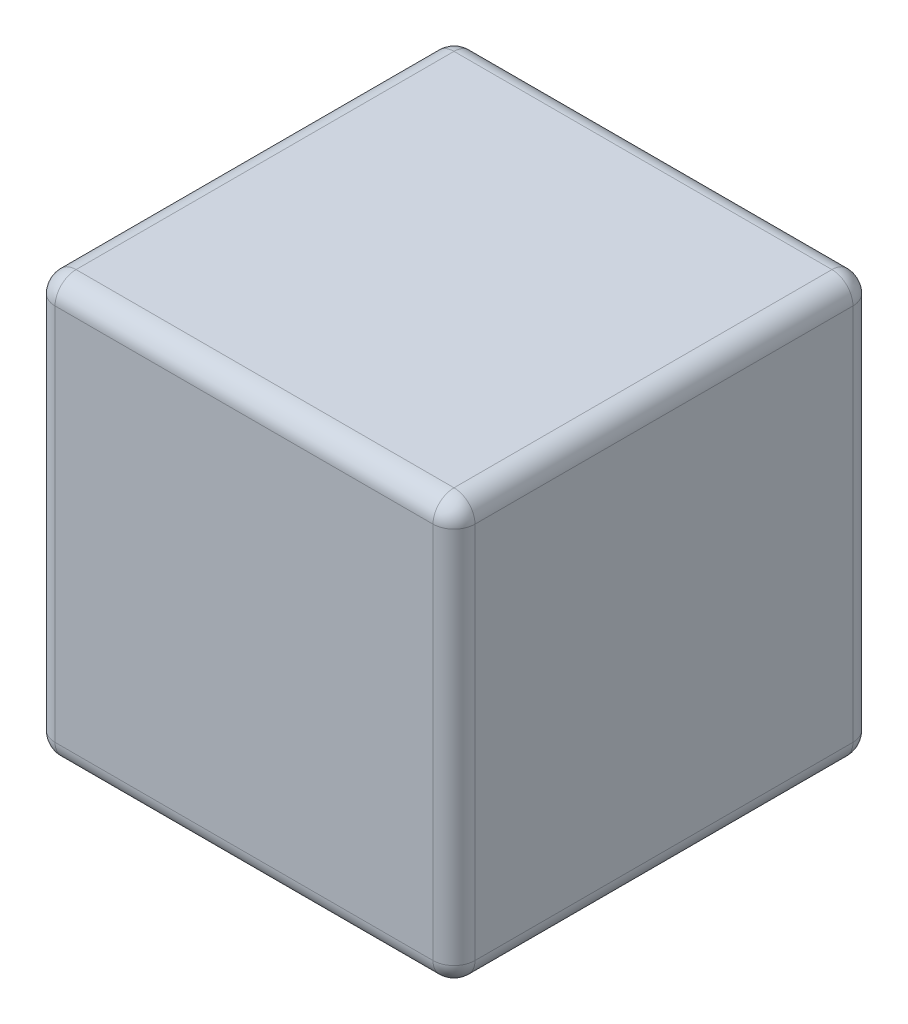
ISO-10303-21;
HEADER;
FILE_DESCRIPTION(('STEP AP214'),'2;1');
FILE_NAME('part.step','',(''),(''),'','','');
FILE_SCHEMA(('AUTOMOTIVE_DESIGN { 1 0 10303 214 1 1 1 1 }'));
ENDSEC;
DATA;
#1=APPLICATION_CONTEXT('core data for automotive mechanical design processes');
#2=APPLICATION_PROTOCOL_DEFINITION('international standard','automotive_design',2000,#1);
#3=PRODUCT_CONTEXT('',#1,'mechanical');
#4=PRODUCT('Part','Part','',(#3));
#5=PRODUCT_RELATED_PRODUCT_CATEGORY('part','',(#4));
#6=PRODUCT_DEFINITION_FORMATION('','',#4);
#7=PRODUCT_DEFINITION_CONTEXT('part definition',#1,'design');
#8=PRODUCT_DEFINITION('design','',#6,#7);
#9=PRODUCT_DEFINITION_SHAPE('','',#8);
#10=(LENGTH_UNIT() NAMED_UNIT(*) SI_UNIT(.MILLI.,.METRE.));
#11=(NAMED_UNIT(*) PLANE_ANGLE_UNIT() SI_UNIT($,.RADIAN.));
#12=(NAMED_UNIT(*) SI_UNIT($,.STERADIAN.) SOLID_ANGLE_UNIT());
#13=UNCERTAINTY_MEASURE_WITH_UNIT(LENGTH_MEASURE(1.E-05),#10,'distance_accuracy_value','');
#14=(GEOMETRIC_REPRESENTATION_CONTEXT(3) GLOBAL_UNCERTAINTY_ASSIGNED_CONTEXT((#13)) GLOBAL_UNIT_ASSIGNED_CONTEXT((#10,
#11,#12)) REPRESENTATION_CONTEXT('',''));
#15=CARTESIAN_POINT('',(0.,0.,0.));
#16=DIRECTION('',(0.,0.,1.));
#17=DIRECTION('',(1.,0.,0.));
#18=AXIS2_PLACEMENT_3D('',#15,#16,#17);
#19=CARTESIAN_POINT('',(0.,100.,0.));
#20=DIRECTION('',(1.,0.,0.));
#21=DIRECTION('',(0.,0.,-1.));
#22=AXIS2_PLACEMENT_3D('',#19,#20,#21);
#23=PLANE('',#22);
#24=DIRECTION('',(0.,0.,1.));
#25=VECTOR('',#24,1.);
#26=CARTESIAN_POINT('',(0.,95.,0.));
#27=LINE('',#26,#25);
#28=CARTESIAN_POINT('',(0.,95.,-5.));
#29=VERTEX_POINT('',#28);
#30=CARTESIAN_POINT('',(0.,95.,-95.));
#31=VERTEX_POINT('',#30);
#32=EDGE_CURVE('E192',#29,#31,#27,.F.);
#33=ORIENTED_EDGE('',*,*,#32,.T.);
#34=DIRECTION('',(0.,-1.,0.));
#35=VECTOR('',#34,1.);
#36=CARTESIAN_POINT('',(0.,100.,-95.));
#37=LINE('',#36,#35);
#38=CARTESIAN_POINT('',(0.,5.,-95.));
#39=VERTEX_POINT('',#38);
#40=EDGE_CURVE('E194',#31,#39,#37,.T.);
#41=ORIENTED_EDGE('',*,*,#40,.T.);
#42=DIRECTION('',(0.,0.,1.));
#43=VECTOR('',#42,1.);
#44=CARTESIAN_POINT('',(0.,5.,0.));
#45=LINE('',#44,#43);
#46=CARTESIAN_POINT('',(0.,5.,-5.));
#47=VERTEX_POINT('',#46);
#48=EDGE_CURVE('E190',#39,#47,#45,.T.);
#49=ORIENTED_EDGE('',*,*,#48,.T.);
#50=DIRECTION('',(0.,-1.,0.));
#51=VECTOR('',#50,1.);
#52=CARTESIAN_POINT('',(0.,100.,-5.));
#53=LINE('',#52,#51);
#54=EDGE_CURVE('E188',#47,#29,#53,.F.);
#55=ORIENTED_EDGE('',*,*,#54,.T.);
#56=EDGE_LOOP('',(#33,#41,#49,#55));
#57=FACE_BOUND('',#56,.T.);
#58=ADVANCED_FACE('F34',(#57),#23,.F.);
#59=CARTESIAN_POINT('',(0.,100.,0.));
#60=DIRECTION('',(0.,0.,-1.));
#61=DIRECTION('',(-1.,0.,0.));
#62=AXIS2_PLACEMENT_3D('',#59,#60,#61);
#63=PLANE('',#62);
#64=DIRECTION('',(1.,0.,0.));
#65=VECTOR('',#64,1.);
#66=CARTESIAN_POINT('',(0.,95.,0.));
#67=LINE('',#66,#65);
#68=CARTESIAN_POINT('',(95.,95.,0.));
#69=VERTEX_POINT('',#68);
#70=CARTESIAN_POINT('',(5.,95.,0.));
#71=VERTEX_POINT('',#70);
#72=EDGE_CURVE('E43',#69,#71,#67,.F.);
#73=ORIENTED_EDGE('',*,*,#72,.T.);
#74=DIRECTION('',(0.,-1.,0.));
#75=VECTOR('',#74,1.);
#76=CARTESIAN_POINT('',(5.,100.,0.));
#77=LINE('',#76,#75);
#78=CARTESIAN_POINT('',(5.,5.,0.));
#79=VERTEX_POINT('',#78);
#80=EDGE_CURVE('E11',#71,#79,#77,.T.);
#81=ORIENTED_EDGE('',*,*,#80,.T.);
#82=DIRECTION('',(1.,0.,0.));
#83=VECTOR('',#82,1.);
#84=CARTESIAN_POINT('',(100.,5.,0.));
#85=LINE('',#84,#83);
#86=CARTESIAN_POINT('',(95.,5.,0.));
#87=VERTEX_POINT('',#86);
#88=EDGE_CURVE('E197',#79,#87,#85,.T.);
#89=ORIENTED_EDGE('',*,*,#88,.T.);
#90=DIRECTION('',(0.,-1.,0.));
#91=VECTOR('',#90,1.);
#92=CARTESIAN_POINT('',(95.,100.,0.));
#93=LINE('',#92,#91);
#94=EDGE_CURVE('E54',#87,#69,#93,.F.);
#95=ORIENTED_EDGE('',*,*,#94,.T.);
#96=EDGE_LOOP('',(#73,#81,#89,#95));
#97=FACE_BOUND('',#96,.T.);
#98=ADVANCED_FACE('F349',(#97),#63,.F.);
#99=CARTESIAN_POINT('',(100.,100.,0.));
#100=DIRECTION('',(-1.,0.,0.));
#101=DIRECTION('',(0.,0.,1.));
#102=AXIS2_PLACEMENT_3D('',#99,#100,#101);
#103=PLANE('',#102);
#104=DIRECTION('',(0.,0.,-1.));
#105=VECTOR('',#104,1.);
#106=CARTESIAN_POINT('',(100.,5.,-100.));
#107=LINE('',#106,#105);
#108=CARTESIAN_POINT('',(100.,5.,-5.));
#109=VERTEX_POINT('',#108);
#110=CARTESIAN_POINT('',(100.,5.,-95.));
#111=VERTEX_POINT('',#110);
#112=EDGE_CURVE('E167',#109,#111,#107,.T.);
#113=ORIENTED_EDGE('',*,*,#112,.T.);
#114=DIRECTION('',(0.,-1.,0.));
#115=VECTOR('',#114,1.);
#116=CARTESIAN_POINT('',(100.,100.,-95.));
#117=LINE('',#116,#115);
#118=CARTESIAN_POINT('',(100.,95.,-95.));
#119=VERTEX_POINT('',#118);
#120=EDGE_CURVE('E129',#111,#119,#117,.F.);
#121=ORIENTED_EDGE('',*,*,#120,.T.);
#122=DIRECTION('',(0.,0.,-1.));
#123=VECTOR('',#122,1.);
#124=CARTESIAN_POINT('',(100.,95.,0.));
#125=LINE('',#124,#123);
#126=CARTESIAN_POINT('',(100.,95.,-5.));
#127=VERTEX_POINT('',#126);
#128=EDGE_CURVE('E161',#119,#127,#125,.F.);
#129=ORIENTED_EDGE('',*,*,#128,.T.);
#130=DIRECTION('',(0.,-1.,0.));
#131=VECTOR('',#130,1.);
#132=CARTESIAN_POINT('',(100.,100.,-5.));
#133=LINE('',#132,#131);
#134=EDGE_CURVE('E159',#127,#109,#133,.T.);
#135=ORIENTED_EDGE('',*,*,#134,.T.);
#136=EDGE_LOOP('',(#113,#121,#129,#135));
#137=FACE_BOUND('',#136,.T.);
#138=ADVANCED_FACE('F319',(#137),#103,.F.);
#139=CARTESIAN_POINT('',(0.,100.,-100.));
#140=DIRECTION('',(0.,0.,1.));
#141=DIRECTION('',(1.,0.,0.));
#142=AXIS2_PLACEMENT_3D('',#139,#140,#141);
#143=PLANE('',#142);
#144=DIRECTION('',(-1.,0.,0.));
#145=VECTOR('',#144,1.);
#146=CARTESIAN_POINT('',(0.,95.,-100.));
#147=LINE('',#146,#145);
#148=CARTESIAN_POINT('',(4.99999999999997,95.,-100.));
#149=VERTEX_POINT('',#148);
#150=CARTESIAN_POINT('',(95.,95.,-100.));
#151=VERTEX_POINT('',#150);
#152=EDGE_CURVE('E157',#149,#151,#147,.F.);
#153=ORIENTED_EDGE('',*,*,#152,.T.);
#154=DIRECTION('',(0.,-1.,0.));
#155=VECTOR('',#154,1.);
#156=CARTESIAN_POINT('',(95.,100.,-100.));
#157=LINE('',#156,#155);
#158=CARTESIAN_POINT('',(95.,5.,-100.));
#159=VERTEX_POINT('',#158);
#160=EDGE_CURVE('E127',#151,#159,#157,.T.);
#161=ORIENTED_EDGE('',*,*,#160,.T.);
#162=DIRECTION('',(-1.,0.,0.));
#163=VECTOR('',#162,1.);
#164=CARTESIAN_POINT('',(0.,5.,-100.));
#165=LINE('',#164,#163);
#166=CARTESIAN_POINT('',(4.99999999999997,5.,-100.));
#167=VERTEX_POINT('',#166);
#168=EDGE_CURVE('E145',#159,#167,#165,.T.);
#169=ORIENTED_EDGE('',*,*,#168,.T.);
#170=DIRECTION('',(0.,-1.,0.));
#171=VECTOR('',#170,1.);
#172=CARTESIAN_POINT('',(4.99999999999997,100.,-100.));
#173=LINE('',#172,#171);
#174=EDGE_CURVE('E151',#167,#149,#173,.F.);
#175=ORIENTED_EDGE('',*,*,#174,.T.);
#176=EDGE_LOOP('',(#153,#161,#169,#175));
#177=FACE_BOUND('',#176,.T.);
#178=CARTESIAN_POINT('',(50.,50.,-100.));
#179=DIRECTION('',(0.,0.,-1.));
#180=DIRECTION('',(-1.,0.,0.));
#181=AXIS2_PLACEMENT_3D('',#178,#179,#180);
#182=CIRCLE('',#181,10.);
#183=CARTESIAN_POINT('',(40.,50.,-100.));
#184=VERTEX_POINT('',#183);
#185=EDGE_CURVE('E289',#184,#184,#182,.T.);
#186=ORIENTED_EDGE('',*,*,#185,.F.);
#187=EDGE_LOOP('',(#186));
#188=FACE_BOUND('',#187,.T.);
#189=ADVANCED_FACE('F154',(#177,#188),#143,.F.);
#190=CARTESIAN_POINT('',(0.,100.,0.));
#191=DIRECTION('',(0.,-1.,0.));
#192=DIRECTION('',(0.,0.,-1.));
#193=AXIS2_PLACEMENT_3D('',#190,#191,#192);
#194=PLANE('',#193);
#195=DIRECTION('',(0.,0.,-1.));
#196=VECTOR('',#195,1.);
#197=CARTESIAN_POINT('',(95.,100.,0.));
#198=LINE('',#197,#196);
#199=CARTESIAN_POINT('',(95.,100.,-5.));
#200=VERTEX_POINT('',#199);
#201=CARTESIAN_POINT('',(95.,100.,-95.));
#202=VERTEX_POINT('',#201);
#203=EDGE_CURVE('E183',#200,#202,#198,.T.);
#204=ORIENTED_EDGE('',*,*,#203,.T.);
#205=DIRECTION('',(-1.,0.,0.));
#206=VECTOR('',#205,1.);
#207=CARTESIAN_POINT('',(0.,100.,-95.));
#208=LINE('',#207,#206);
#209=CARTESIAN_POINT('',(4.99999999999997,100.,-95.));
#210=VERTEX_POINT('',#209);
#211=EDGE_CURVE('E185',#202,#210,#208,.T.);
#212=ORIENTED_EDGE('',*,*,#211,.T.);
#213=DIRECTION('',(0.,0.,1.));
#214=VECTOR('',#213,1.);
#215=CARTESIAN_POINT('',(5.,100.,0.));
#216=LINE('',#215,#214);
#217=CARTESIAN_POINT('',(5.,100.,-5.));
#218=VERTEX_POINT('',#217);
#219=EDGE_CURVE('E181',#210,#218,#216,.T.);
#220=ORIENTED_EDGE('',*,*,#219,.T.);
#221=DIRECTION('',(1.,0.,0.));
#222=VECTOR('',#221,1.);
#223=CARTESIAN_POINT('',(0.,100.,-5.));
#224=LINE('',#223,#222);
#225=EDGE_CURVE('E179',#218,#200,#224,.T.);
#226=ORIENTED_EDGE('',*,*,#225,.T.);
#227=EDGE_LOOP('',(#204,#212,#220,#226));
#228=FACE_BOUND('',#227,.T.);
#229=ADVANCED_FACE('F622',(#228),#194,.F.);
#230=CARTESIAN_POINT('',(0.,0.,0.));
#231=DIRECTION('',(0.,-1.,0.));
#232=DIRECTION('',(0.,0.,-1.));
#233=AXIS2_PLACEMENT_3D('',#230,#231,#232);
#234=PLANE('',#233);
#235=DIRECTION('',(0.,0.,-1.));
#236=VECTOR('',#235,1.);
#237=CARTESIAN_POINT('',(95.,0.,0.));
#238=LINE('',#237,#236);
#239=CARTESIAN_POINT('',(95.,0.,-95.));
#240=VERTEX_POINT('',#239);
#241=CARTESIAN_POINT('',(95.,0.,-5.));
#242=VERTEX_POINT('',#241);
#243=EDGE_CURVE('E174',#240,#242,#238,.F.);
#244=ORIENTED_EDGE('',*,*,#243,.T.);
#245=DIRECTION('',(1.,0.,0.));
#246=VECTOR('',#245,1.);
#247=CARTESIAN_POINT('',(0.,0.,-5.));
#248=LINE('',#247,#246);
#249=CARTESIAN_POINT('',(5.,0.,-5.));
#250=VERTEX_POINT('',#249);
#251=EDGE_CURVE('E177',#242,#250,#248,.F.);
#252=ORIENTED_EDGE('',*,*,#251,.T.);
#253=DIRECTION('',(0.,0.,1.));
#254=VECTOR('',#253,1.);
#255=CARTESIAN_POINT('',(4.99999999999997,0.,-100.));
#256=LINE('',#255,#254);
#257=CARTESIAN_POINT('',(4.99999999999997,0.,-95.));
#258=VERTEX_POINT('',#257);
#259=EDGE_CURVE('E172',#250,#258,#256,.F.);
#260=ORIENTED_EDGE('',*,*,#259,.T.);
#261=DIRECTION('',(-1.,0.,0.));
#262=VECTOR('',#261,1.);
#263=CARTESIAN_POINT('',(100.,0.,-95.));
#264=LINE('',#263,#262);
#265=EDGE_CURVE('E170',#258,#240,#264,.F.);
#266=ORIENTED_EDGE('',*,*,#265,.T.);
#267=EDGE_LOOP('',(#244,#252,#260,#266));
#268=FACE_BOUND('',#267,.T.);
#269=CARTESIAN_POINT('',(21.7157287525381,0.,-21.7157287525381));
#270=DIRECTION('',(0.,-1.,0.));
#271=DIRECTION('',(0.,0.,-1.));
#272=AXIS2_PLACEMENT_3D('',#269,#270,#271);
#273=CIRCLE('',#272,9.99999999999999);
#274=CARTESIAN_POINT('',(21.7157287525381,0.,-31.7157287525381));
#275=VERTEX_POINT('',#274);
#276=EDGE_CURVE('E276',#275,#275,#273,.T.);
#277=ORIENTED_EDGE('',*,*,#276,.F.);
#278=EDGE_LOOP('',(#277));
#279=FACE_BOUND('',#278,.T.);
#280=CARTESIAN_POINT('',(78.2842712474619,0.,-78.2842712474619));
#281=DIRECTION('',(0.,-1.,0.));
#282=DIRECTION('',(0.,0.,-1.));
#283=AXIS2_PLACEMENT_3D('',#280,#281,#282);
#284=CIRCLE('',#283,9.99999999999999);
#285=CARTESIAN_POINT('',(78.2842712474619,0.,-88.2842712474619));
#286=VERTEX_POINT('',#285);
#287=EDGE_CURVE('E282',#286,#286,#284,.T.);
#288=ORIENTED_EDGE('',*,*,#287,.F.);
#289=EDGE_LOOP('',(#288));
#290=FACE_BOUND('',#289,.T.);
#291=CARTESIAN_POINT('',(78.2842712474619,0.,-21.7157287525381));
#292=DIRECTION('',(0.,-1.,0.));
#293=DIRECTION('',(0.,0.,-1.));
#294=AXIS2_PLACEMENT_3D('',#291,#292,#293);
#295=CIRCLE('',#294,9.99999999999999);
#296=CARTESIAN_POINT('',(78.2842712474619,0.,-31.7157287525381));
#297=VERTEX_POINT('',#296);
#298=EDGE_CURVE('E268',#297,#297,#295,.T.);
#299=ORIENTED_EDGE('',*,*,#298,.F.);
#300=EDGE_LOOP('',(#299));
#301=FACE_BOUND('',#300,.T.);
#302=CARTESIAN_POINT('',(50.,0.,-50.));
#303=DIRECTION('',(0.,-1.,0.));
#304=DIRECTION('',(0.,0.,-1.));
#305=AXIS2_PLACEMENT_3D('',#302,#303,#304);
#306=CIRCLE('',#305,10.);
#307=CARTESIAN_POINT('',(50.,0.,-60.));
#308=VERTEX_POINT('',#307);
#309=EDGE_CURVE('E257',#308,#308,#306,.T.);
#310=ORIENTED_EDGE('',*,*,#309,.F.);
#311=EDGE_LOOP('',(#310));
#312=FACE_BOUND('',#311,.T.);
#313=CARTESIAN_POINT('',(21.7157287525381,0.,-78.2842712474619));
#314=DIRECTION('',(0.,-1.,0.));
#315=DIRECTION('',(0.,0.,-1.));
#316=AXIS2_PLACEMENT_3D('',#313,#314,#315);
#317=CIRCLE('',#316,10.);
#318=CARTESIAN_POINT('',(21.7157287525381,0.,-88.2842712474619));
#319=VERTEX_POINT('',#318);
#320=EDGE_CURVE('E275',#319,#319,#317,.T.);
#321=ORIENTED_EDGE('',*,*,#320,.F.);
#322=EDGE_LOOP('',(#321));
#323=FACE_BOUND('',#322,.T.);
#324=ADVANCED_FACE('F327',(#268,#279,#290,#301,#312,#323),#234,.T.);
#325=CARTESIAN_POINT('',(50.,50.,-90.));
#326=DIRECTION('',(0.,0.,-1.));
#327=DIRECTION('',(-1.,0.,0.));
#328=AXIS2_PLACEMENT_3D('',#325,#326,#327);
#329=CYLINDRICAL_SURFACE('',#328,10.);
#330=CARTESIAN_POINT('',(50.,50.,-90.));
#331=DIRECTION('',(0.,0.,-1.));
#332=DIRECTION('',(-1.,0.,0.));
#333=AXIS2_PLACEMENT_3D('',#330,#331,#332);
#334=CIRCLE('',#333,10.);
#335=CARTESIAN_POINT('',(40.,50.,-90.));
#336=VERTEX_POINT('',#335);
#337=EDGE_CURVE('E152',#336,#336,#334,.T.);
#338=ORIENTED_EDGE('',*,*,#337,.F.);
#339=EDGE_LOOP('',(#338));
#340=FACE_BOUND('',#339,.T.);
#341=ORIENTED_EDGE('',*,*,#185,.T.);
#342=EDGE_LOOP('',(#341));
#343=FACE_BOUND('',#342,.T.);
#344=ADVANCED_FACE('F606',(#340,#343),#329,.F.);
#345=CARTESIAN_POINT('',(50.,50.,-90.));
#346=DIRECTION('',(0.,0.,-1.));
#347=DIRECTION('',(-1.,0.,0.));
#348=AXIS2_PLACEMENT_3D('',#345,#346,#347);
#349=PLANE('',#348);
#350=ORIENTED_EDGE('',*,*,#337,.T.);
#351=EDGE_LOOP('',(#350));
#352=FACE_BOUND('',#351,.T.);
#353=ADVANCED_FACE('F597',(#352),#349,.T.);
#354=CARTESIAN_POINT('',(21.7157287525381,10.,-78.2842712474619));
#355=DIRECTION('',(0.,-1.,0.));
#356=DIRECTION('',(0.,0.,-1.));
#357=AXIS2_PLACEMENT_3D('',#354,#355,#356);
#358=CYLINDRICAL_SURFACE('',#357,10.);
#359=CARTESIAN_POINT('',(21.7157287525381,10.,-78.2842712474619));
#360=DIRECTION('',(0.,-1.,0.));
#361=DIRECTION('',(0.,0.,-1.));
#362=AXIS2_PLACEMENT_3D('',#359,#360,#361);
#363=CIRCLE('',#362,10.);
#364=CARTESIAN_POINT('',(21.7157287525381,10.,-88.2842712474619));
#365=VERTEX_POINT('',#364);
#366=EDGE_CURVE('E286',#365,#365,#363,.T.);
#367=ORIENTED_EDGE('',*,*,#366,.F.);
#368=EDGE_LOOP('',(#367));
#369=FACE_BOUND('',#368,.T.);
#370=ORIENTED_EDGE('',*,*,#320,.T.);
#371=EDGE_LOOP('',(#370));
#372=FACE_BOUND('',#371,.T.);
#373=ADVANCED_FACE('F588',(#369,#372),#358,.F.);
#374=CARTESIAN_POINT('',(21.7157287525381,10.,-78.2842712474619));
#375=DIRECTION('',(0.,-1.,0.));
#376=DIRECTION('',(0.,0.,-1.));
#377=AXIS2_PLACEMENT_3D('',#374,#375,#376);
#378=PLANE('',#377);
#379=ORIENTED_EDGE('',*,*,#366,.T.);
#380=EDGE_LOOP('',(#379));
#381=FACE_BOUND('',#380,.T.);
#382=ADVANCED_FACE('F579',(#381),#378,.T.);
#383=CARTESIAN_POINT('',(50.,10.,-50.));
#384=DIRECTION('',(0.,-1.,0.));
#385=DIRECTION('',(0.,0.,-1.));
#386=AXIS2_PLACEMENT_3D('',#383,#384,#385);
#387=CYLINDRICAL_SURFACE('',#386,10.);
#388=CARTESIAN_POINT('',(50.,10.,-50.));
#389=DIRECTION('',(0.,-1.,0.));
#390=DIRECTION('',(0.,0.,-1.));
#391=AXIS2_PLACEMENT_3D('',#388,#389,#390);
#392=CIRCLE('',#391,10.);
#393=CARTESIAN_POINT('',(50.,10.,-60.));
#394=VERTEX_POINT('',#393);
#395=EDGE_CURVE('E263',#394,#394,#392,.T.);
#396=ORIENTED_EDGE('',*,*,#395,.F.);
#397=EDGE_LOOP('',(#396));
#398=FACE_BOUND('',#397,.T.);
#399=ORIENTED_EDGE('',*,*,#309,.T.);
#400=EDGE_LOOP('',(#399));
#401=FACE_BOUND('',#400,.T.);
#402=ADVANCED_FACE('F570',(#398,#401),#387,.F.);
#403=CARTESIAN_POINT('',(50.,10.,-50.));
#404=DIRECTION('',(0.,-1.,0.));
#405=DIRECTION('',(0.,0.,-1.));
#406=AXIS2_PLACEMENT_3D('',#403,#404,#405);
#407=PLANE('',#406);
#408=ORIENTED_EDGE('',*,*,#395,.T.);
#409=EDGE_LOOP('',(#408));
#410=FACE_BOUND('',#409,.T.);
#411=ADVANCED_FACE('F561',(#410),#407,.T.);
#412=CARTESIAN_POINT('',(78.2842712474619,10.,-21.7157287525381));
#413=DIRECTION('',(0.,-1.,0.));
#414=DIRECTION('',(0.,0.,-1.));
#415=AXIS2_PLACEMENT_3D('',#412,#413,#414);
#416=CYLINDRICAL_SURFACE('',#415,9.99999999999999);
#417=CARTESIAN_POINT('',(78.2842712474619,10.,-21.7157287525381));
#418=DIRECTION('',(0.,-1.,0.));
#419=DIRECTION('',(0.,0.,-1.));
#420=AXIS2_PLACEMENT_3D('',#417,#418,#419);
#421=CIRCLE('',#420,9.99999999999999);
#422=CARTESIAN_POINT('',(78.2842712474619,10.,-31.7157287525381));
#423=VERTEX_POINT('',#422);
#424=EDGE_CURVE('E285',#423,#423,#421,.T.);
#425=ORIENTED_EDGE('',*,*,#424,.F.);
#426=EDGE_LOOP('',(#425));
#427=FACE_BOUND('',#426,.T.);
#428=ORIENTED_EDGE('',*,*,#298,.T.);
#429=EDGE_LOOP('',(#428));
#430=FACE_BOUND('',#429,.T.);
#431=ADVANCED_FACE('F552',(#427,#430),#416,.F.);
#432=CARTESIAN_POINT('',(78.2842712474619,10.,-21.7157287525381));
#433=DIRECTION('',(0.,-1.,0.));
#434=DIRECTION('',(0.,0.,-1.));
#435=AXIS2_PLACEMENT_3D('',#432,#433,#434);
#436=PLANE('',#435);
#437=ORIENTED_EDGE('',*,*,#424,.T.);
#438=EDGE_LOOP('',(#437));
#439=FACE_BOUND('',#438,.T.);
#440=ADVANCED_FACE('F543',(#439),#436,.T.);
#441=CARTESIAN_POINT('',(78.2842712474619,10.,-78.2842712474619));
#442=DIRECTION('',(0.,-1.,0.));
#443=DIRECTION('',(0.,0.,-1.));
#444=AXIS2_PLACEMENT_3D('',#441,#442,#443);
#445=CYLINDRICAL_SURFACE('',#444,9.99999999999999);
#446=CARTESIAN_POINT('',(78.2842712474619,10.,-78.2842712474619));
#447=DIRECTION('',(0.,-1.,0.));
#448=DIRECTION('',(0.,0.,-1.));
#449=AXIS2_PLACEMENT_3D('',#446,#447,#448);
#450=CIRCLE('',#449,9.99999999999999);
#451=CARTESIAN_POINT('',(78.2842712474619,10.,-88.2842712474619));
#452=VERTEX_POINT('',#451);
#453=EDGE_CURVE('E279',#452,#452,#450,.T.);
#454=ORIENTED_EDGE('',*,*,#453,.F.);
#455=EDGE_LOOP('',(#454));
#456=FACE_BOUND('',#455,.T.);
#457=ORIENTED_EDGE('',*,*,#287,.T.);
#458=EDGE_LOOP('',(#457));
#459=FACE_BOUND('',#458,.T.);
#460=ADVANCED_FACE('F534',(#456,#459),#445,.F.);
#461=CARTESIAN_POINT('',(78.2842712474619,10.,-78.2842712474619));
#462=DIRECTION('',(0.,-1.,0.));
#463=DIRECTION('',(0.,0.,-1.));
#464=AXIS2_PLACEMENT_3D('',#461,#462,#463);
#465=PLANE('',#464);
#466=ORIENTED_EDGE('',*,*,#453,.T.);
#467=EDGE_LOOP('',(#466));
#468=FACE_BOUND('',#467,.T.);
#469=ADVANCED_FACE('F525',(#468),#465,.T.);
#470=CARTESIAN_POINT('',(21.7157287525381,10.,-21.7157287525381));
#471=DIRECTION('',(0.,-1.,0.));
#472=DIRECTION('',(0.,0.,-1.));
#473=AXIS2_PLACEMENT_3D('',#470,#471,#472);
#474=CYLINDRICAL_SURFACE('',#473,9.99999999999999);
#475=CARTESIAN_POINT('',(21.7157287525381,10.,-21.7157287525381));
#476=DIRECTION('',(0.,-1.,0.));
#477=DIRECTION('',(0.,0.,-1.));
#478=AXIS2_PLACEMENT_3D('',#475,#476,#477);
#479=CIRCLE('',#478,9.99999999999999);
#480=CARTESIAN_POINT('',(21.7157287525381,10.,-31.7157287525381));
#481=VERTEX_POINT('',#480);
#482=EDGE_CURVE('E272',#481,#481,#479,.T.);
#483=ORIENTED_EDGE('',*,*,#482,.F.);
#484=EDGE_LOOP('',(#483));
#485=FACE_BOUND('',#484,.T.);
#486=ORIENTED_EDGE('',*,*,#276,.T.);
#487=EDGE_LOOP('',(#486));
#488=FACE_BOUND('',#487,.T.);
#489=ADVANCED_FACE('F516',(#485,#488),#474,.F.);
#490=CARTESIAN_POINT('',(21.7157287525381,10.,-21.7157287525381));
#491=DIRECTION('',(0.,-1.,0.));
#492=DIRECTION('',(0.,0.,-1.));
#493=AXIS2_PLACEMENT_3D('',#490,#491,#492);
#494=PLANE('',#493);
#495=ORIENTED_EDGE('',*,*,#482,.T.);
#496=EDGE_LOOP('',(#495));
#497=FACE_BOUND('',#496,.T.);
#498=ADVANCED_FACE('F507',(#497),#494,.T.);
#499=CARTESIAN_POINT('',(5.,100.,-5.));
#500=DIRECTION('',(0.,-1.,0.));
#501=DIRECTION('',(0.,0.,-1.));
#502=AXIS2_PLACEMENT_3D('',#499,#500,#501);
#503=CYLINDRICAL_SURFACE('',#502,5.);
#504=CARTESIAN_POINT('',(5.,95.,-5.));
#505=DIRECTION('',(0.,1.,0.));
#506=DIRECTION('',(0.,0.,1.));
#507=AXIS2_PLACEMENT_3D('',#504,#505,#506);
#508=CIRCLE('',#507,5.);
#509=EDGE_CURVE('E38',#29,#71,#508,.T.);
#510=ORIENTED_EDGE('',*,*,#509,.F.);
#511=ORIENTED_EDGE('',*,*,#54,.F.);
#512=CARTESIAN_POINT('',(5.,5.,-5.));
#513=DIRECTION('',(0.,-1.,0.));
#514=DIRECTION('',(0.,0.,-1.));
#515=AXIS2_PLACEMENT_3D('',#512,#513,#514);
#516=CIRCLE('',#515,5.);
#517=EDGE_CURVE('E250',#79,#47,#516,.T.);
#518=ORIENTED_EDGE('',*,*,#517,.F.);
#519=ORIENTED_EDGE('',*,*,#80,.F.);
#520=EDGE_LOOP('',(#510,#511,#518,#519));
#521=FACE_BOUND('',#520,.T.);
#522=ADVANCED_FACE('F36',(#521),#503,.T.);
#523=CARTESIAN_POINT('',(5.,95.,-5.));
#524=DIRECTION('',(0.,0.,1.));
#525=DIRECTION('',(1.,0.,0.));
#526=AXIS2_PLACEMENT_3D('',#523,#524,#525);
#527=SPHERICAL_SURFACE('',#526,5.);
#528=CARTESIAN_POINT('',(5.,95.,-5.));
#529=DIRECTION('',(0.,0.,1.));
#530=DIRECTION('',(1.,0.,0.));
#531=AXIS2_PLACEMENT_3D('',#528,#529,#530);
#532=CIRCLE('',#531,5.);
#533=EDGE_CURVE('E245',#29,#218,#532,.F.);
#534=ORIENTED_EDGE('',*,*,#533,.F.);
#535=ORIENTED_EDGE('',*,*,#509,.T.);
#536=CARTESIAN_POINT('',(5.,95.,-5.));
#537=DIRECTION('',(-1.,0.,0.));
#538=DIRECTION('',(0.,0.,1.));
#539=AXIS2_PLACEMENT_3D('',#536,#537,#538);
#540=CIRCLE('',#539,5.);
#541=EDGE_CURVE('E248',#218,#71,#540,.F.);
#542=ORIENTED_EDGE('',*,*,#541,.F.);
#543=EDGE_LOOP('',(#534,#535,#542));
#544=FACE_BOUND('',#543,.T.);
#545=ADVANCED_FACE('F493',(#544),#527,.T.);
#546=CARTESIAN_POINT('',(5.,5.,-5.));
#547=DIRECTION('',(0.,0.,1.));
#548=DIRECTION('',(1.,0.,0.));
#549=AXIS2_PLACEMENT_3D('',#546,#547,#548);
#550=SPHERICAL_SURFACE('',#549,5.);
#551=CARTESIAN_POINT('',(5.,5.,-5.));
#552=DIRECTION('',(-1.,0.,0.));
#553=DIRECTION('',(0.,0.,1.));
#554=AXIS2_PLACEMENT_3D('',#551,#552,#553);
#555=CIRCLE('',#554,5.);
#556=EDGE_CURVE('E239',#79,#250,#555,.F.);
#557=ORIENTED_EDGE('',*,*,#556,.F.);
#558=ORIENTED_EDGE('',*,*,#517,.T.);
#559=CARTESIAN_POINT('',(5.,5.,-5.));
#560=DIRECTION('',(0.,0.,1.));
#561=DIRECTION('',(1.,0.,0.));
#562=AXIS2_PLACEMENT_3D('',#559,#560,#561);
#563=CIRCLE('',#562,5.);
#564=EDGE_CURVE('E242',#250,#47,#563,.F.);
#565=ORIENTED_EDGE('',*,*,#564,.F.);
#566=EDGE_LOOP('',(#557,#558,#565));
#567=FACE_BOUND('',#566,.T.);
#568=ADVANCED_FACE('F484',(#567),#550,.T.);
#569=CARTESIAN_POINT('',(0.,95.,-5.));
#570=DIRECTION('',(1.,0.,0.));
#571=DIRECTION('',(0.,0.,-1.));
#572=AXIS2_PLACEMENT_3D('',#569,#570,#571);
#573=CYLINDRICAL_SURFACE('',#572,5.);
#574=ORIENTED_EDGE('',*,*,#541,.T.);
#575=ORIENTED_EDGE('',*,*,#72,.F.);
#576=CARTESIAN_POINT('',(95.,95.,-5.));
#577=DIRECTION('',(1.,0.,0.));
#578=DIRECTION('',(0.,0.,-1.));
#579=AXIS2_PLACEMENT_3D('',#576,#577,#578);
#580=CIRCLE('',#579,5.);
#581=EDGE_CURVE('E233',#200,#69,#580,.T.);
#582=ORIENTED_EDGE('',*,*,#581,.F.);
#583=ORIENTED_EDGE('',*,*,#225,.F.);
#584=EDGE_LOOP('',(#574,#575,#582,#583));
#585=FACE_BOUND('',#584,.T.);
#586=ADVANCED_FACE('F475',(#585),#573,.T.);
#587=CARTESIAN_POINT('',(5.,95.,0.));
#588=DIRECTION('',(0.,0.,1.));
#589=DIRECTION('',(1.,0.,0.));
#590=AXIS2_PLACEMENT_3D('',#587,#588,#589);
#591=CYLINDRICAL_SURFACE('',#590,5.);
#592=ORIENTED_EDGE('',*,*,#533,.T.);
#593=ORIENTED_EDGE('',*,*,#219,.F.);
#594=CARTESIAN_POINT('',(4.99999999999997,95.,-95.));
#595=DIRECTION('',(0.,0.,-1.));
#596=DIRECTION('',(-1.,0.,0.));
#597=AXIS2_PLACEMENT_3D('',#594,#595,#596);
#598=CIRCLE('',#597,5.);
#599=EDGE_CURVE('E230',#31,#210,#598,.T.);
#600=ORIENTED_EDGE('',*,*,#599,.F.);
#601=ORIENTED_EDGE('',*,*,#32,.F.);
#602=EDGE_LOOP('',(#592,#593,#600,#601));
#603=FACE_BOUND('',#602,.T.);
#604=ADVANCED_FACE('F467',(#603),#591,.T.);
#605=CARTESIAN_POINT('',(4.99999999999997,100.,-95.));
#606=DIRECTION('',(0.,-1.,0.));
#607=DIRECTION('',(0.,0.,-1.));
#608=AXIS2_PLACEMENT_3D('',#605,#606,#607);
#609=CYLINDRICAL_SURFACE('',#608,5.);
#610=CARTESIAN_POINT('',(4.99999999999997,5.,-95.));
#611=DIRECTION('',(0.,-1.,0.));
#612=DIRECTION('',(0.,0.,-1.));
#613=AXIS2_PLACEMENT_3D('',#610,#611,#612);
#614=CIRCLE('',#613,5.);
#615=EDGE_CURVE('E224',#39,#167,#614,.T.);
#616=ORIENTED_EDGE('',*,*,#615,.F.);
#617=ORIENTED_EDGE('',*,*,#40,.F.);
#618=CARTESIAN_POINT('',(4.99999999999997,95.,-95.));
#619=DIRECTION('',(0.,1.,0.));
#620=DIRECTION('',(0.,0.,1.));
#621=AXIS2_PLACEMENT_3D('',#618,#619,#620);
#622=CIRCLE('',#621,5.);
#623=EDGE_CURVE('E227',#149,#31,#622,.T.);
#624=ORIENTED_EDGE('',*,*,#623,.F.);
#625=ORIENTED_EDGE('',*,*,#174,.F.);
#626=EDGE_LOOP('',(#616,#617,#624,#625));
#627=FACE_BOUND('',#626,.T.);
#628=ADVANCED_FACE('F300',(#627),#609,.T.);
#629=CARTESIAN_POINT('',(5.,5.,0.));
#630=DIRECTION('',(0.,0.,-1.));
#631=DIRECTION('',(-1.,0.,0.));
#632=AXIS2_PLACEMENT_3D('',#629,#630,#631);
#633=CYLINDRICAL_SURFACE('',#632,5.);
#634=ORIENTED_EDGE('',*,*,#564,.T.);
#635=ORIENTED_EDGE('',*,*,#48,.F.);
#636=CARTESIAN_POINT('',(4.99999999999997,5.,-95.));
#637=DIRECTION('',(0.,0.,-1.));
#638=DIRECTION('',(-1.,0.,0.));
#639=AXIS2_PLACEMENT_3D('',#636,#637,#638);
#640=CIRCLE('',#639,5.);
#641=EDGE_CURVE('E222',#258,#39,#640,.T.);
#642=ORIENTED_EDGE('',*,*,#641,.F.);
#643=ORIENTED_EDGE('',*,*,#259,.F.);
#644=EDGE_LOOP('',(#634,#635,#642,#643));
#645=FACE_BOUND('',#644,.T.);
#646=ADVANCED_FACE('F334',(#645),#633,.T.);
#647=CARTESIAN_POINT('',(0.,5.,-5.));
#648=DIRECTION('',(-1.,0.,0.));
#649=DIRECTION('',(0.,0.,1.));
#650=AXIS2_PLACEMENT_3D('',#647,#648,#649);
#651=CYLINDRICAL_SURFACE('',#650,5.);
#652=ORIENTED_EDGE('',*,*,#556,.T.);
#653=ORIENTED_EDGE('',*,*,#251,.F.);
#654=CARTESIAN_POINT('',(95.,5.,-5.));
#655=DIRECTION('',(1.,0.,0.));
#656=DIRECTION('',(0.,0.,-1.));
#657=AXIS2_PLACEMENT_3D('',#654,#655,#656);
#658=CIRCLE('',#657,5.);
#659=EDGE_CURVE('E219',#87,#242,#658,.T.);
#660=ORIENTED_EDGE('',*,*,#659,.F.);
#661=ORIENTED_EDGE('',*,*,#88,.F.);
#662=EDGE_LOOP('',(#652,#653,#660,#661));
#663=FACE_BOUND('',#662,.T.);
#664=ADVANCED_FACE('F443',(#663),#651,.T.);
#665=CARTESIAN_POINT('',(95.,100.,-5.));
#666=DIRECTION('',(0.,-1.,0.));
#667=DIRECTION('',(0.,0.,-1.));
#668=AXIS2_PLACEMENT_3D('',#665,#666,#667);
#669=CYLINDRICAL_SURFACE('',#668,5.);
#670=CARTESIAN_POINT('',(95.,95.,-5.));
#671=DIRECTION('',(0.,1.,0.));
#672=DIRECTION('',(0.,0.,1.));
#673=AXIS2_PLACEMENT_3D('',#670,#671,#672);
#674=CIRCLE('',#673,5.);
#675=EDGE_CURVE('E236',#69,#127,#674,.T.);
#676=ORIENTED_EDGE('',*,*,#675,.F.);
#677=ORIENTED_EDGE('',*,*,#94,.F.);
#678=CARTESIAN_POINT('',(95.,5.,-5.));
#679=DIRECTION('',(0.,-1.,0.));
#680=DIRECTION('',(0.,0.,-1.));
#681=AXIS2_PLACEMENT_3D('',#678,#679,#680);
#682=CIRCLE('',#681,5.);
#683=EDGE_CURVE('E216',#109,#87,#682,.T.);
#684=ORIENTED_EDGE('',*,*,#683,.F.);
#685=ORIENTED_EDGE('',*,*,#134,.F.);
#686=EDGE_LOOP('',(#676,#677,#684,#685));
#687=FACE_BOUND('',#686,.T.);
#688=ADVANCED_FACE('F434',(#687),#669,.T.);
#689=CARTESIAN_POINT('',(95.,95.,-5.));
#690=DIRECTION('',(0.,0.,1.));
#691=DIRECTION('',(1.,0.,0.));
#692=AXIS2_PLACEMENT_3D('',#689,#690,#691);
#693=SPHERICAL_SURFACE('',#692,5.);
#694=ORIENTED_EDGE('',*,*,#581,.T.);
#695=ORIENTED_EDGE('',*,*,#675,.T.);
#696=CARTESIAN_POINT('',(95.,95.,-5.));
#697=DIRECTION('',(0.,0.,1.));
#698=DIRECTION('',(1.,0.,0.));
#699=AXIS2_PLACEMENT_3D('',#696,#697,#698);
#700=CIRCLE('',#699,5.);
#701=EDGE_CURVE('E213',#200,#127,#700,.F.);
#702=ORIENTED_EDGE('',*,*,#701,.F.);
#703=EDGE_LOOP('',(#694,#695,#702));
#704=FACE_BOUND('',#703,.T.);
#705=ADVANCED_FACE('F346',(#704),#693,.T.);
#706=CARTESIAN_POINT('',(4.99999999999997,95.,-95.));
#707=DIRECTION('',(0.,0.,1.));
#708=DIRECTION('',(1.,0.,0.));
#709=AXIS2_PLACEMENT_3D('',#706,#707,#708);
#710=SPHERICAL_SURFACE('',#709,5.);
#711=ORIENTED_EDGE('',*,*,#623,.T.);
#712=ORIENTED_EDGE('',*,*,#599,.T.);
#713=CARTESIAN_POINT('',(4.99999999999997,95.,-95.));
#714=DIRECTION('',(-1.,0.,0.));
#715=DIRECTION('',(0.,0.,1.));
#716=AXIS2_PLACEMENT_3D('',#713,#714,#715);
#717=CIRCLE('',#716,5.);
#718=EDGE_CURVE('E211',#149,#210,#717,.F.);
#719=ORIENTED_EDGE('',*,*,#718,.F.);
#720=EDGE_LOOP('',(#711,#712,#719));
#721=FACE_BOUND('',#720,.T.);
#722=ADVANCED_FACE('F303',(#721),#710,.T.);
#723=CARTESIAN_POINT('',(4.99999999999997,5.,-95.));
#724=DIRECTION('',(0.,0.,1.));
#725=DIRECTION('',(1.,0.,0.));
#726=AXIS2_PLACEMENT_3D('',#723,#724,#725);
#727=SPHERICAL_SURFACE('',#726,5.);
#728=ORIENTED_EDGE('',*,*,#641,.T.);
#729=ORIENTED_EDGE('',*,*,#615,.T.);
#730=CARTESIAN_POINT('',(4.99999999999997,5.,-95.));
#731=DIRECTION('',(-1.,0.,0.));
#732=DIRECTION('',(0.,0.,1.));
#733=AXIS2_PLACEMENT_3D('',#730,#731,#732);
#734=CIRCLE('',#733,5.);
#735=EDGE_CURVE('E148',#258,#167,#734,.F.);
#736=ORIENTED_EDGE('',*,*,#735,.F.);
#737=EDGE_LOOP('',(#728,#729,#736));
#738=FACE_BOUND('',#737,.T.);
#739=ADVANCED_FACE('F336',(#738),#727,.T.);
#740=CARTESIAN_POINT('',(95.,5.,-5.));
#741=DIRECTION('',(0.,0.,1.));
#742=DIRECTION('',(1.,0.,0.));
#743=AXIS2_PLACEMENT_3D('',#740,#741,#742);
#744=SPHERICAL_SURFACE('',#743,5.);
#745=ORIENTED_EDGE('',*,*,#683,.T.);
#746=ORIENTED_EDGE('',*,*,#659,.T.);
#747=CARTESIAN_POINT('',(95.,5.,-5.));
#748=DIRECTION('',(0.,0.,1.));
#749=DIRECTION('',(1.,0.,0.));
#750=AXIS2_PLACEMENT_3D('',#747,#748,#749);
#751=CIRCLE('',#750,5.);
#752=EDGE_CURVE('E208',#109,#242,#751,.F.);
#753=ORIENTED_EDGE('',*,*,#752,.F.);
#754=EDGE_LOOP('',(#745,#746,#753));
#755=FACE_BOUND('',#754,.T.);
#756=ADVANCED_FACE('F338',(#755),#744,.T.);
#757=CARTESIAN_POINT('',(95.,95.,0.));
#758=DIRECTION('',(0.,0.,-1.));
#759=DIRECTION('',(-1.,0.,0.));
#760=AXIS2_PLACEMENT_3D('',#757,#758,#759);
#761=CYLINDRICAL_SURFACE('',#760,5.);
#762=ORIENTED_EDGE('',*,*,#701,.T.);
#763=ORIENTED_EDGE('',*,*,#128,.F.);
#764=CARTESIAN_POINT('',(95.,95.,-95.));
#765=DIRECTION('',(0.,0.,-1.));
#766=DIRECTION('',(-1.,0.,0.));
#767=AXIS2_PLACEMENT_3D('',#764,#765,#766);
#768=CIRCLE('',#767,5.);
#769=EDGE_CURVE('E205',#202,#119,#768,.T.);
#770=ORIENTED_EDGE('',*,*,#769,.F.);
#771=ORIENTED_EDGE('',*,*,#203,.F.);
#772=EDGE_LOOP('',(#762,#763,#770,#771));
#773=FACE_BOUND('',#772,.T.);
#774=ADVANCED_FACE('F315',(#773),#761,.T.);
#775=CARTESIAN_POINT('',(0.,95.,-95.));
#776=DIRECTION('',(-1.,0.,0.));
#777=DIRECTION('',(0.,0.,1.));
#778=AXIS2_PLACEMENT_3D('',#775,#776,#777);
#779=CYLINDRICAL_SURFACE('',#778,5.);
#780=ORIENTED_EDGE('',*,*,#718,.T.);
#781=ORIENTED_EDGE('',*,*,#211,.F.);
#782=CARTESIAN_POINT('',(95.,95.,-95.));
#783=DIRECTION('',(1.,0.,0.));
#784=DIRECTION('',(0.,0.,-1.));
#785=AXIS2_PLACEMENT_3D('',#782,#783,#784);
#786=CIRCLE('',#785,5.);
#787=EDGE_CURVE('E142',#151,#202,#786,.T.);
#788=ORIENTED_EDGE('',*,*,#787,.F.);
#789=ORIENTED_EDGE('',*,*,#152,.F.);
#790=EDGE_LOOP('',(#780,#781,#788,#789));
#791=FACE_BOUND('',#790,.T.);
#792=ADVANCED_FACE('F307',(#791),#779,.T.);
#793=CARTESIAN_POINT('',(0.,5.,-95.));
#794=DIRECTION('',(1.,0.,0.));
#795=DIRECTION('',(0.,0.,-1.));
#796=AXIS2_PLACEMENT_3D('',#793,#794,#795);
#797=CYLINDRICAL_SURFACE('',#796,5.);
#798=ORIENTED_EDGE('',*,*,#735,.T.);
#799=ORIENTED_EDGE('',*,*,#168,.F.);
#800=CARTESIAN_POINT('',(95.,5.,-95.));
#801=DIRECTION('',(1.,0.,0.));
#802=DIRECTION('',(0.,0.,-1.));
#803=AXIS2_PLACEMENT_3D('',#800,#801,#802);
#804=CIRCLE('',#803,5.);
#805=EDGE_CURVE('E135',#240,#159,#804,.T.);
#806=ORIENTED_EDGE('',*,*,#805,.F.);
#807=ORIENTED_EDGE('',*,*,#265,.F.);
#808=EDGE_LOOP('',(#798,#799,#806,#807));
#809=FACE_BOUND('',#808,.T.);
#810=ADVANCED_FACE('F146',(#809),#797,.T.);
#811=CARTESIAN_POINT('',(95.,5.,0.));
#812=DIRECTION('',(0.,0.,1.));
#813=DIRECTION('',(1.,0.,0.));
#814=AXIS2_PLACEMENT_3D('',#811,#812,#813);
#815=CYLINDRICAL_SURFACE('',#814,5.);
#816=ORIENTED_EDGE('',*,*,#752,.T.);
#817=ORIENTED_EDGE('',*,*,#243,.F.);
#818=CARTESIAN_POINT('',(95.,5.,-95.));
#819=DIRECTION('',(0.,0.,-1.));
#820=DIRECTION('',(-1.,0.,0.));
#821=AXIS2_PLACEMENT_3D('',#818,#819,#820);
#822=CIRCLE('',#821,5.);
#823=EDGE_CURVE('E139',#111,#240,#822,.T.);
#824=ORIENTED_EDGE('',*,*,#823,.F.);
#825=ORIENTED_EDGE('',*,*,#112,.F.);
#826=EDGE_LOOP('',(#816,#817,#824,#825));
#827=FACE_BOUND('',#826,.T.);
#828=ADVANCED_FACE('F324',(#827),#815,.T.);
#829=CARTESIAN_POINT('',(95.,95.,-95.));
#830=DIRECTION('',(0.,0.,1.));
#831=DIRECTION('',(1.,0.,0.));
#832=AXIS2_PLACEMENT_3D('',#829,#830,#831);
#833=SPHERICAL_SURFACE('',#832,5.);
#834=ORIENTED_EDGE('',*,*,#787,.T.);
#835=ORIENTED_EDGE('',*,*,#769,.T.);
#836=CARTESIAN_POINT('',(95.,95.,-95.));
#837=DIRECTION('',(0.,1.,0.));
#838=DIRECTION('',(0.,0.,1.));
#839=AXIS2_PLACEMENT_3D('',#836,#837,#838);
#840=CIRCLE('',#839,5.);
#841=EDGE_CURVE('E132',#151,#119,#840,.F.);
#842=ORIENTED_EDGE('',*,*,#841,.F.);
#843=EDGE_LOOP('',(#834,#835,#842));
#844=FACE_BOUND('',#843,.T.);
#845=ADVANCED_FACE('F311',(#844),#833,.T.);
#846=CARTESIAN_POINT('',(95.,5.,-95.));
#847=DIRECTION('',(0.,0.,1.));
#848=DIRECTION('',(1.,0.,0.));
#849=AXIS2_PLACEMENT_3D('',#846,#847,#848);
#850=SPHERICAL_SURFACE('',#849,5.);
#851=ORIENTED_EDGE('',*,*,#823,.T.);
#852=ORIENTED_EDGE('',*,*,#805,.T.);
#853=CARTESIAN_POINT('',(95.,5.,-95.));
#854=DIRECTION('',(0.,-1.,0.));
#855=DIRECTION('',(0.,0.,-1.));
#856=AXIS2_PLACEMENT_3D('',#853,#854,#855);
#857=CIRCLE('',#856,5.);
#858=EDGE_CURVE('E123',#111,#159,#857,.F.);
#859=ORIENTED_EDGE('',*,*,#858,.F.);
#860=EDGE_LOOP('',(#851,#852,#859));
#861=FACE_BOUND('',#860,.T.);
#862=ADVANCED_FACE('F137',(#861),#850,.T.);
#863=CARTESIAN_POINT('',(95.,100.,-95.));
#864=DIRECTION('',(0.,-1.,0.));
#865=DIRECTION('',(0.,0.,-1.));
#866=AXIS2_PLACEMENT_3D('',#863,#864,#865);
#867=CYLINDRICAL_SURFACE('',#866,5.);
#868=ORIENTED_EDGE('',*,*,#841,.T.);
#869=ORIENTED_EDGE('',*,*,#120,.F.);
#870=ORIENTED_EDGE('',*,*,#858,.T.);
#871=ORIENTED_EDGE('',*,*,#160,.F.);
#872=EDGE_LOOP('',(#868,#869,#870,#871));
#873=FACE_BOUND('',#872,.T.);
#874=ADVANCED_FACE('F125',(#873),#867,.T.);
#875=CLOSED_SHELL('',(#58,#98,#138,#189,#229,#324,#344,#353,#373,#382,#402,#411,#431,#440,#460,
#469,#489,#498,#522,#545,#568,#586,#604,#628,#646,#664,#688,#705,#722,#739,#756,#774,#792,#810,
#828,#845,#862,#874));
#876=MANIFOLD_SOLID_BREP('B2',#875);
#877=ADVANCED_BREP_SHAPE_REPRESENTATION('',(#18,#876),#14);
#878=SHAPE_DEFINITION_REPRESENTATION(#9,#877);
ENDSEC;
END-ISO-10303-21;
